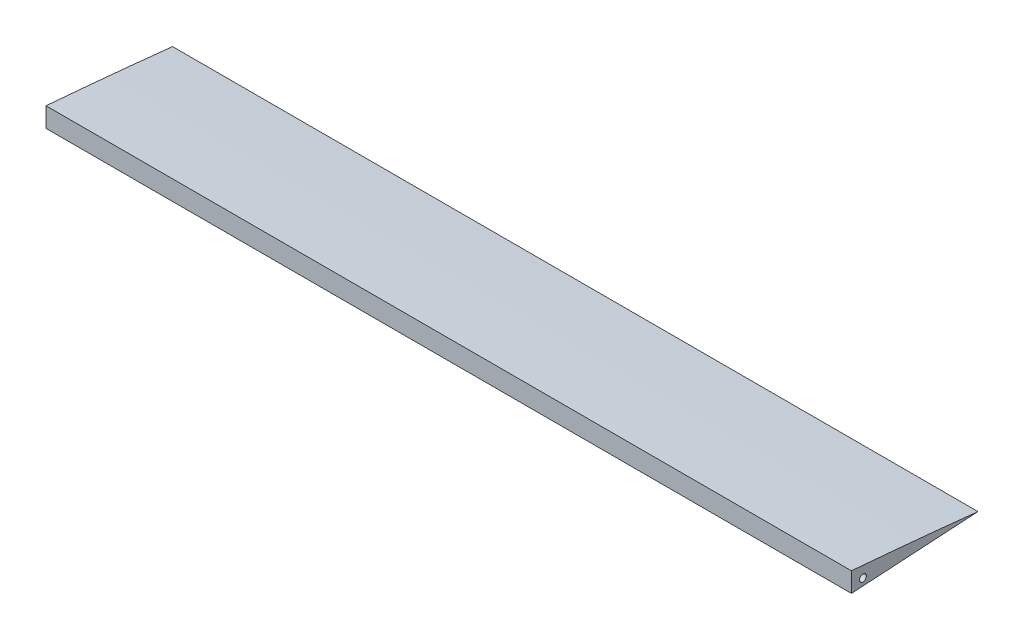
ISO-10303-21;
HEADER;
FILE_DESCRIPTION(('STEP AP214'),'2;1');
FILE_NAME('part.step','',(''),(''),'','','');
FILE_SCHEMA(('AUTOMOTIVE_DESIGN { 1 0 10303 214 1 1 1 1 }'));
ENDSEC;
DATA;
#1=APPLICATION_CONTEXT('core data for automotive mechanical design processes');
#2=APPLICATION_PROTOCOL_DEFINITION('international standard','automotive_design',2000,#1);
#3=PRODUCT_CONTEXT('',#1,'mechanical');
#4=PRODUCT('Part','Part','',(#3));
#5=PRODUCT_RELATED_PRODUCT_CATEGORY('part','',(#4));
#6=PRODUCT_DEFINITION_FORMATION('','',#4);
#7=PRODUCT_DEFINITION_CONTEXT('part definition',#1,'design');
#8=PRODUCT_DEFINITION('design','',#6,#7);
#9=PRODUCT_DEFINITION_SHAPE('','',#8);
#10=(LENGTH_UNIT() NAMED_UNIT(*) SI_UNIT(.MILLI.,.METRE.));
#11=(NAMED_UNIT(*) PLANE_ANGLE_UNIT() SI_UNIT($,.RADIAN.));
#12=(NAMED_UNIT(*) SI_UNIT($,.STERADIAN.) SOLID_ANGLE_UNIT());
#13=UNCERTAINTY_MEASURE_WITH_UNIT(LENGTH_MEASURE(1.E-05),#10,'distance_accuracy_value','');
#14=(GEOMETRIC_REPRESENTATION_CONTEXT(3) GLOBAL_UNCERTAINTY_ASSIGNED_CONTEXT((#13)) GLOBAL_UNIT_ASSIGNED_CONTEXT((#10,
#11,#12)) REPRESENTATION_CONTEXT('',''));
#15=CARTESIAN_POINT('',(0.,0.,0.));
#16=DIRECTION('',(0.,0.,1.));
#17=DIRECTION('',(1.,0.,0.));
#18=AXIS2_PLACEMENT_3D('',#15,#16,#17);
#19=CARTESIAN_POINT('',(350.,-2234.91419119646,28.838300543628));
#20=DIRECTION('',(-1.,0.,0.));
#21=DIRECTION('',(0.,0.,1.));
#22=AXIS2_PLACEMENT_3D('',#19,#20,#21);
#23=PLANE('',#22);
#24=CARTESIAN_POINT('',(350.,-2234.91419119646,28.838300543628));
#25=DIRECTION('',(1.,0.,0.));
#26=DIRECTION('',(0.,0.,1.));
#27=AXIS2_PLACEMENT_3D('',#24,#25,#26);
#28=CIRCLE('',#27,2247.77561349793);
#29=CARTESIAN_POINT('',(350.,2.2583817803635E-12,-211.273687130126));
#30=VERTEX_POINT('',#29);
#31=CARTESIAN_POINT('',(350.,5.22615276760696,-156.273687130126));
#32=VERTEX_POINT('',#31);
#33=EDGE_CURVE('E82',#30,#32,#28,.T.);
#34=ORIENTED_EDGE('',*,*,#33,.T.);
#35=DIRECTION('',(0.,-1.,0.));
#36=VECTOR('',#35,1.);
#37=CARTESIAN_POINT('',(350.,5.22615276760696,-156.273687130126));
#38=LINE('',#37,#36);
#39=CARTESIAN_POINT('',(350.,-3.30000000000048,-156.273687130126));
#40=VERTEX_POINT('',#39);
#41=EDGE_CURVE('E77',#32,#40,#38,.T.);
#42=ORIENTED_EDGE('',*,*,#41,.T.);
#43=DIRECTION('',(0.,0.0598922907279962,-0.998204845465776));
#44=VECTOR('',#43,1.);
#45=CARTESIAN_POINT('',(350.,-3.30000000000048,-156.273687130126));
#46=LINE('',#45,#44);
#47=EDGE_CURVE('E57',#40,#30,#46,.T.);
#48=ORIENTED_EDGE('',*,*,#47,.T.);
#49=EDGE_LOOP('',(#34,#42,#48));
#50=FACE_BOUND('',#49,.T.);
#51=CARTESIAN_POINT('',(350.,2.2583817803635E-12,-161.273687130126));
#52=DIRECTION('',(1.,0.,0.));
#53=DIRECTION('',(0.,0.,-1.));
#54=AXIS2_PLACEMENT_3D('',#51,#52,#53);
#55=CIRCLE('',#54,1.5);
#56=CARTESIAN_POINT('',(350.,2.2583817803635E-12,-162.773687130126));
#57=VERTEX_POINT('',#56);
#58=EDGE_CURVE('E94',#57,#57,#55,.T.);
#59=ORIENTED_EDGE('',*,*,#58,.F.);
#60=EDGE_LOOP('',(#59));
#61=FACE_BOUND('',#60,.T.);
#62=ADVANCED_FACE('F39',(#50,#61),#23,.F.);
#63=CARTESIAN_POINT('',(0.,-2234.91419119646,28.838300543628));
#64=DIRECTION('',(-1.,0.,0.));
#65=DIRECTION('',(0.,0.,1.));
#66=AXIS2_PLACEMENT_3D('',#63,#64,#65);
#67=PLANE('',#66);
#68=CARTESIAN_POINT('',(0.,-2234.91419119646,28.838300543628));
#69=DIRECTION('',(1.,0.,0.));
#70=DIRECTION('',(0.,0.,1.));
#71=AXIS2_PLACEMENT_3D('',#68,#69,#70);
#72=CIRCLE('',#71,2247.77561349793);
#73=CARTESIAN_POINT('',(0.,2.2583817803635E-12,-211.273687130126));
#74=VERTEX_POINT('',#73);
#75=CARTESIAN_POINT('',(0.,5.22615276760696,-156.273687130126));
#76=VERTEX_POINT('',#75);
#77=EDGE_CURVE('E90',#74,#76,#72,.T.);
#78=ORIENTED_EDGE('',*,*,#77,.F.);
#79=DIRECTION('',(0.,0.0598922907279962,-0.998204845465776));
#80=VECTOR('',#79,1.);
#81=CARTESIAN_POINT('',(0.,-3.30000000000048,-156.273687130126));
#82=LINE('',#81,#80);
#83=CARTESIAN_POINT('',(0.,-3.30000000000048,-156.273687130126));
#84=VERTEX_POINT('',#83);
#85=EDGE_CURVE('E74',#84,#74,#82,.T.);
#86=ORIENTED_EDGE('',*,*,#85,.F.);
#87=DIRECTION('',(0.,-1.,0.));
#88=VECTOR('',#87,1.);
#89=CARTESIAN_POINT('',(0.,5.22615276760696,-156.273687130126));
#90=LINE('',#89,#88);
#91=EDGE_CURVE('E69',#76,#84,#90,.T.);
#92=ORIENTED_EDGE('',*,*,#91,.F.);
#93=EDGE_LOOP('',(#78,#86,#92));
#94=FACE_BOUND('',#93,.T.);
#95=CARTESIAN_POINT('',(0.,2.2583817803635E-12,-161.273687130126));
#96=DIRECTION('',(1.,0.,0.));
#97=DIRECTION('',(0.,0.,-1.));
#98=AXIS2_PLACEMENT_3D('',#95,#96,#97);
#99=CIRCLE('',#98,1.5);
#100=CARTESIAN_POINT('',(0.,2.2583817803635E-12,-162.773687130126));
#101=VERTEX_POINT('',#100);
#102=EDGE_CURVE('E100',#101,#101,#99,.T.);
#103=ORIENTED_EDGE('',*,*,#102,.T.);
#104=EDGE_LOOP('',(#103));
#105=FACE_BOUND('',#104,.T.);
#106=ADVANCED_FACE('F109',(#94,#105),#67,.T.);
#107=CARTESIAN_POINT('',(350.,-2234.91419119646,28.838300543628));
#108=DIRECTION('',(-1.,0.,0.));
#109=DIRECTION('',(0.,0.,1.));
#110=AXIS2_PLACEMENT_3D('',#107,#108,#109);
#111=CYLINDRICAL_SURFACE('',#110,2247.77561349793);
#112=ORIENTED_EDGE('',*,*,#77,.T.);
#113=DIRECTION('',(-1.,0.,0.));
#114=VECTOR('',#113,1.);
#115=CARTESIAN_POINT('',(350.,5.22615276760696,-156.273687130126));
#116=LINE('',#115,#114);
#117=EDGE_CURVE('E11',#32,#76,#116,.T.);
#118=ORIENTED_EDGE('',*,*,#117,.F.);
#119=ORIENTED_EDGE('',*,*,#33,.F.);
#120=DIRECTION('',(-1.,0.,0.));
#121=VECTOR('',#120,1.);
#122=CARTESIAN_POINT('',(350.,2.2583817803635E-12,-211.273687130126));
#123=LINE('',#122,#121);
#124=EDGE_CURVE('E91',#30,#74,#123,.T.);
#125=ORIENTED_EDGE('',*,*,#124,.T.);
#126=EDGE_LOOP('',(#112,#118,#119,#125));
#127=FACE_BOUND('',#126,.T.);
#128=ADVANCED_FACE('F41',(#127),#111,.T.);
#129=CARTESIAN_POINT('',(350.,5.22615276760696,-156.273687130126));
#130=DIRECTION('',(0.,0.,-1.));
#131=DIRECTION('',(-1.,0.,0.));
#132=AXIS2_PLACEMENT_3D('',#129,#130,#131);
#133=PLANE('',#132);
#134=ORIENTED_EDGE('',*,*,#91,.T.);
#135=DIRECTION('',(-1.,0.,0.));
#136=VECTOR('',#135,1.);
#137=CARTESIAN_POINT('',(350.,-3.30000000000048,-156.273687130126));
#138=LINE('',#137,#136);
#139=EDGE_CURVE('E49',#40,#84,#138,.T.);
#140=ORIENTED_EDGE('',*,*,#139,.F.);
#141=ORIENTED_EDGE('',*,*,#41,.F.);
#142=ORIENTED_EDGE('',*,*,#117,.T.);
#143=EDGE_LOOP('',(#134,#140,#141,#142));
#144=FACE_BOUND('',#143,.T.);
#145=ADVANCED_FACE('F78',(#144),#133,.F.);
#146=CARTESIAN_POINT('',(350.,-3.30000000000048,-156.273687130126));
#147=DIRECTION('',(0.,0.998204845465776,0.0598922907279962));
#148=DIRECTION('',(0.,-0.0598922907279962,0.998204845465776));
#149=AXIS2_PLACEMENT_3D('',#146,#147,#148);
#150=PLANE('',#149);
#151=ORIENTED_EDGE('',*,*,#85,.T.);
#152=ORIENTED_EDGE('',*,*,#124,.F.);
#153=ORIENTED_EDGE('',*,*,#47,.F.);
#154=ORIENTED_EDGE('',*,*,#139,.T.);
#155=EDGE_LOOP('',(#151,#152,#153,#154));
#156=FACE_BOUND('',#155,.T.);
#157=ADVANCED_FACE('F108',(#156),#150,.F.);
#158=CARTESIAN_POINT('',(350.,2.2583817803635E-12,-161.273687130126));
#159=DIRECTION('',(-1.,0.,0.));
#160=DIRECTION('',(0.,0.,1.));
#161=AXIS2_PLACEMENT_3D('',#158,#159,#160);
#162=CYLINDRICAL_SURFACE('',#161,1.5);
#163=ORIENTED_EDGE('',*,*,#58,.T.);
#164=EDGE_LOOP('',(#163));
#165=FACE_BOUND('',#164,.T.);
#166=ORIENTED_EDGE('',*,*,#102,.F.);
#167=EDGE_LOOP('',(#166));
#168=FACE_BOUND('',#167,.T.);
#169=ADVANCED_FACE('F118',(#165,#168),#162,.F.);
#170=CLOSED_SHELL('',(#62,#106,#128,#145,#157,#169));
#171=MANIFOLD_SOLID_BREP('B2',#170);
#172=ADVANCED_BREP_SHAPE_REPRESENTATION('',(#18,#171),#14);
#173=SHAPE_DEFINITION_REPRESENTATION(#9,#172);
ENDSEC;
END-ISO-10303-21;
